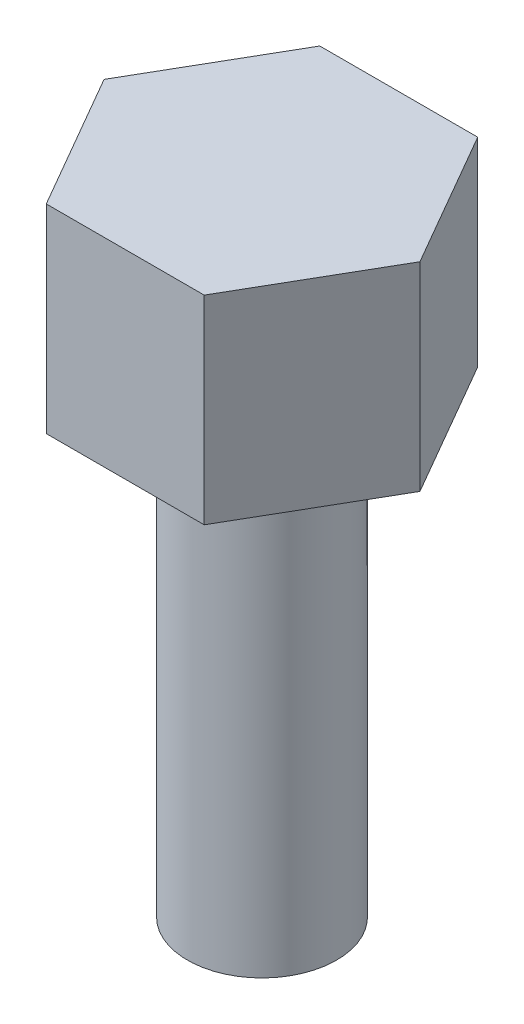
ISO-10303-21;
HEADER;
FILE_DESCRIPTION(('STEP AP214'),'2;1');
FILE_NAME('part.step','',(''),(''),'','','');
FILE_SCHEMA(('AUTOMOTIVE_DESIGN { 1 0 10303 214 1 1 1 1 }'));
ENDSEC;
DATA;
#1=APPLICATION_CONTEXT('core data for automotive mechanical design processes');
#2=APPLICATION_PROTOCOL_DEFINITION('international standard','automotive_design',2000,#1);
#3=PRODUCT_CONTEXT('',#1,'mechanical');
#4=PRODUCT('Part','Part','',(#3));
#5=PRODUCT_RELATED_PRODUCT_CATEGORY('part','',(#4));
#6=PRODUCT_DEFINITION_FORMATION('','',#4);
#7=PRODUCT_DEFINITION_CONTEXT('part definition',#1,'design');
#8=PRODUCT_DEFINITION('design','',#6,#7);
#9=PRODUCT_DEFINITION_SHAPE('','',#8);
#10=(LENGTH_UNIT() NAMED_UNIT(*) SI_UNIT(.MILLI.,.METRE.));
#11=(NAMED_UNIT(*) PLANE_ANGLE_UNIT() SI_UNIT($,.RADIAN.));
#12=(NAMED_UNIT(*) SI_UNIT($,.STERADIAN.) SOLID_ANGLE_UNIT());
#13=UNCERTAINTY_MEASURE_WITH_UNIT(LENGTH_MEASURE(1.E-05),#10,'distance_accuracy_value','');
#14=(GEOMETRIC_REPRESENTATION_CONTEXT(3) GLOBAL_UNCERTAINTY_ASSIGNED_CONTEXT((#13)) GLOBAL_UNIT_ASSIGNED_CONTEXT((#10,
#11,#12)) REPRESENTATION_CONTEXT('',''));
#15=CARTESIAN_POINT('',(0.,0.,0.));
#16=DIRECTION('',(0.,0.,1.));
#17=DIRECTION('',(1.,0.,0.));
#18=AXIS2_PLACEMENT_3D('',#15,#16,#17);
#19=CARTESIAN_POINT('',(1.58771324027147,4.,-2.75));
#20=DIRECTION('',(0.,0.,1.));
#21=DIRECTION('',(1.,0.,0.));
#22=AXIS2_PLACEMENT_3D('',#19,#20,#21);
#23=PLANE('',#22);
#24=DIRECTION('',(-1.,0.,0.));
#25=VECTOR('',#24,1.);
#26=CARTESIAN_POINT('',(1.58771324027147,0.,-2.75));
#27=LINE('',#26,#25);
#28=CARTESIAN_POINT('',(1.58771324027147,0.,-2.75));
#29=VERTEX_POINT('',#28);
#30=CARTESIAN_POINT('',(-1.58771324027147,0.,-2.75));
#31=VERTEX_POINT('',#30);
#32=EDGE_CURVE('E120',#29,#31,#27,.T.);
#33=ORIENTED_EDGE('',*,*,#32,.T.);
#34=DIRECTION('',(0.,-1.,0.));
#35=VECTOR('',#34,1.);
#36=CARTESIAN_POINT('',(-1.58771324027147,4.,-2.75));
#37=LINE('',#36,#35);
#38=CARTESIAN_POINT('',(-1.58771324027147,4.,-2.75));
#39=VERTEX_POINT('',#38);
#40=EDGE_CURVE('E37',#39,#31,#37,.T.);
#41=ORIENTED_EDGE('',*,*,#40,.F.);
#42=DIRECTION('',(-1.,0.,0.));
#43=VECTOR('',#42,1.);
#44=CARTESIAN_POINT('',(1.58771324027147,4.,-2.75));
#45=LINE('',#44,#43);
#46=CARTESIAN_POINT('',(1.58771324027147,4.,-2.75));
#47=VERTEX_POINT('',#46);
#48=EDGE_CURVE('E131',#47,#39,#45,.T.);
#49=ORIENTED_EDGE('',*,*,#48,.F.);
#50=DIRECTION('',(0.,-1.,0.));
#51=VECTOR('',#50,1.);
#52=CARTESIAN_POINT('',(1.58771324027147,4.,-2.75));
#53=LINE('',#52,#51);
#54=EDGE_CURVE('E116',#47,#29,#53,.T.);
#55=ORIENTED_EDGE('',*,*,#54,.T.);
#56=EDGE_LOOP('',(#33,#41,#49,#55));
#57=FACE_BOUND('',#56,.T.);
#58=ADVANCED_FACE('F34',(#57),#23,.F.);
#59=CARTESIAN_POINT('',(-1.58771324027147,4.,-2.75));
#60=DIRECTION('',(0.866025403784439,0.,0.5));
#61=DIRECTION('',(0.5,0.,-0.866025403784439));
#62=AXIS2_PLACEMENT_3D('',#59,#60,#61);
#63=PLANE('',#62);
#64=DIRECTION('',(-0.5,0.,0.866025403784439));
#65=VECTOR('',#64,1.);
#66=CARTESIAN_POINT('',(-1.58771324027147,0.,-2.75));
#67=LINE('',#66,#65);
#68=CARTESIAN_POINT('',(-3.17542648054294,0.,0.));
#69=VERTEX_POINT('',#68);
#70=EDGE_CURVE('E123',#31,#69,#67,.T.);
#71=ORIENTED_EDGE('',*,*,#70,.T.);
#72=DIRECTION('',(0.,-1.,0.));
#73=VECTOR('',#72,1.);
#74=CARTESIAN_POINT('',(-3.17542648054294,4.,0.));
#75=LINE('',#74,#73);
#76=CARTESIAN_POINT('',(-3.17542648054294,4.,0.));
#77=VERTEX_POINT('',#76);
#78=EDGE_CURVE('E134',#77,#69,#75,.T.);
#79=ORIENTED_EDGE('',*,*,#78,.F.);
#80=DIRECTION('',(-0.5,0.,0.866025403784439));
#81=VECTOR('',#80,1.);
#82=CARTESIAN_POINT('',(-1.58771324027147,4.,-2.75));
#83=LINE('',#82,#81);
#84=EDGE_CURVE('E89',#39,#77,#83,.T.);
#85=ORIENTED_EDGE('',*,*,#84,.F.);
#86=ORIENTED_EDGE('',*,*,#40,.T.);
#87=EDGE_LOOP('',(#71,#79,#85,#86));
#88=FACE_BOUND('',#87,.T.);
#89=ADVANCED_FACE('F139',(#88),#63,.F.);
#90=CARTESIAN_POINT('',(-3.17542648054294,4.,0.));
#91=DIRECTION('',(0.866025403784439,0.,-0.5));
#92=DIRECTION('',(-0.5,0.,-0.866025403784438));
#93=AXIS2_PLACEMENT_3D('',#90,#91,#92);
#94=PLANE('',#93);
#95=DIRECTION('',(0.5,0.,0.866025403784438));
#96=VECTOR('',#95,1.);
#97=CARTESIAN_POINT('',(-3.17542648054294,0.,0.));
#98=LINE('',#97,#96);
#99=CARTESIAN_POINT('',(-1.58771324027147,0.,2.75));
#100=VERTEX_POINT('',#99);
#101=EDGE_CURVE('E126',#69,#100,#98,.T.);
#102=ORIENTED_EDGE('',*,*,#101,.T.);
#103=DIRECTION('',(0.,-1.,0.));
#104=VECTOR('',#103,1.);
#105=CARTESIAN_POINT('',(-1.58771324027147,4.,2.75));
#106=LINE('',#105,#104);
#107=CARTESIAN_POINT('',(-1.58771324027147,4.,2.75));
#108=VERTEX_POINT('',#107);
#109=EDGE_CURVE('E111',#108,#100,#106,.T.);
#110=ORIENTED_EDGE('',*,*,#109,.F.);
#111=DIRECTION('',(0.5,0.,0.866025403784438));
#112=VECTOR('',#111,1.);
#113=CARTESIAN_POINT('',(-3.17542648054294,4.,0.));
#114=LINE('',#113,#112);
#115=EDGE_CURVE('E102',#77,#108,#114,.T.);
#116=ORIENTED_EDGE('',*,*,#115,.F.);
#117=ORIENTED_EDGE('',*,*,#78,.T.);
#118=EDGE_LOOP('',(#102,#110,#116,#117));
#119=FACE_BOUND('',#118,.T.);
#120=ADVANCED_FACE('F145',(#119),#94,.F.);
#121=CARTESIAN_POINT('',(-1.58771324027147,4.,2.75));
#122=DIRECTION('',(0.,0.,-1.));
#123=DIRECTION('',(-1.,0.,0.));
#124=AXIS2_PLACEMENT_3D('',#121,#122,#123);
#125=PLANE('',#124);
#126=DIRECTION('',(1.,0.,0.));
#127=VECTOR('',#126,1.);
#128=CARTESIAN_POINT('',(-1.58771324027147,0.,2.75));
#129=LINE('',#128,#127);
#130=CARTESIAN_POINT('',(1.58771324027147,0.,2.75));
#131=VERTEX_POINT('',#130);
#132=EDGE_CURVE('E110',#100,#131,#129,.T.);
#133=ORIENTED_EDGE('',*,*,#132,.T.);
#134=DIRECTION('',(0.,-1.,0.));
#135=VECTOR('',#134,1.);
#136=CARTESIAN_POINT('',(1.58771324027147,4.,2.75));
#137=LINE('',#136,#135);
#138=CARTESIAN_POINT('',(1.58771324027147,4.,2.75));
#139=VERTEX_POINT('',#138);
#140=EDGE_CURVE('E107',#139,#131,#137,.T.);
#141=ORIENTED_EDGE('',*,*,#140,.F.);
#142=DIRECTION('',(1.,0.,0.));
#143=VECTOR('',#142,1.);
#144=CARTESIAN_POINT('',(-1.58771324027147,4.,2.75));
#145=LINE('',#144,#143);
#146=EDGE_CURVE('E96',#108,#139,#145,.T.);
#147=ORIENTED_EDGE('',*,*,#146,.F.);
#148=ORIENTED_EDGE('',*,*,#109,.T.);
#149=EDGE_LOOP('',(#133,#141,#147,#148));
#150=FACE_BOUND('',#149,.T.);
#151=ADVANCED_FACE('F108',(#150),#125,.F.);
#152=CARTESIAN_POINT('',(1.58771324027147,4.,2.75));
#153=DIRECTION('',(-0.866025403784439,0.,-0.5));
#154=DIRECTION('',(-0.5,0.,0.866025403784439));
#155=AXIS2_PLACEMENT_3D('',#152,#153,#154);
#156=PLANE('',#155);
#157=DIRECTION('',(0.5,0.,-0.866025403784439));
#158=VECTOR('',#157,1.);
#159=CARTESIAN_POINT('',(1.58771324027147,0.,2.75));
#160=LINE('',#159,#158);
#161=CARTESIAN_POINT('',(3.17542648054294,0.,0.));
#162=VERTEX_POINT('',#161);
#163=EDGE_CURVE('E74',#131,#162,#160,.T.);
#164=ORIENTED_EDGE('',*,*,#163,.T.);
#165=DIRECTION('',(0.,-1.,0.));
#166=VECTOR('',#165,1.);
#167=CARTESIAN_POINT('',(3.17542648054294,4.,0.));
#168=LINE('',#167,#166);
#169=CARTESIAN_POINT('',(3.17542648054294,4.,0.));
#170=VERTEX_POINT('',#169);
#171=EDGE_CURVE('E112',#170,#162,#168,.T.);
#172=ORIENTED_EDGE('',*,*,#171,.F.);
#173=DIRECTION('',(0.5,0.,-0.866025403784439));
#174=VECTOR('',#173,1.);
#175=CARTESIAN_POINT('',(1.58771324027147,4.,2.75));
#176=LINE('',#175,#174);
#177=EDGE_CURVE('E100',#139,#170,#176,.T.);
#178=ORIENTED_EDGE('',*,*,#177,.F.);
#179=ORIENTED_EDGE('',*,*,#140,.T.);
#180=EDGE_LOOP('',(#164,#172,#178,#179));
#181=FACE_BOUND('',#180,.T.);
#182=ADVANCED_FACE('F114',(#181),#156,.F.);
#183=CARTESIAN_POINT('',(3.17542648054294,4.,0.));
#184=DIRECTION('',(-0.866025403784439,0.,0.5));
#185=DIRECTION('',(0.5,0.,0.866025403784439));
#186=AXIS2_PLACEMENT_3D('',#183,#184,#185);
#187=PLANE('',#186);
#188=DIRECTION('',(-0.5,0.,-0.866025403784439));
#189=VECTOR('',#188,1.);
#190=CARTESIAN_POINT('',(3.17542648054294,0.,0.));
#191=LINE('',#190,#189);
#192=EDGE_CURVE('E80',#162,#29,#191,.T.);
#193=ORIENTED_EDGE('',*,*,#192,.T.);
#194=ORIENTED_EDGE('',*,*,#54,.F.);
#195=DIRECTION('',(-0.5,0.,-0.866025403784439));
#196=VECTOR('',#195,1.);
#197=CARTESIAN_POINT('',(3.17542648054294,4.,0.));
#198=LINE('',#197,#196);
#199=EDGE_CURVE('E51',#170,#47,#198,.T.);
#200=ORIENTED_EDGE('',*,*,#199,.F.);
#201=ORIENTED_EDGE('',*,*,#171,.T.);
#202=EDGE_LOOP('',(#193,#194,#200,#201));
#203=FACE_BOUND('',#202,.T.);
#204=ADVANCED_FACE('F165',(#203),#187,.F.);
#205=CARTESIAN_POINT('',(0.,4.,0.));
#206=DIRECTION('',(0.,1.,0.));
#207=DIRECTION('',(0.,0.,1.));
#208=AXIS2_PLACEMENT_3D('',#205,#206,#207);
#209=PLANE('',#208);
#210=ORIENTED_EDGE('',*,*,#48,.T.);
#211=ORIENTED_EDGE('',*,*,#84,.T.);
#212=ORIENTED_EDGE('',*,*,#115,.T.);
#213=ORIENTED_EDGE('',*,*,#146,.T.);
#214=ORIENTED_EDGE('',*,*,#177,.T.);
#215=ORIENTED_EDGE('',*,*,#199,.T.);
#216=EDGE_LOOP('',(#210,#211,#212,#213,#214,#215));
#217=FACE_BOUND('',#216,.T.);
#218=ADVANCED_FACE('F98',(#217),#209,.T.);
#219=CARTESIAN_POINT('',(0.,0.,0.));
#220=DIRECTION('',(0.,1.,0.));
#221=DIRECTION('',(0.,0.,1.));
#222=AXIS2_PLACEMENT_3D('',#219,#220,#221);
#223=PLANE('',#222);
#224=CARTESIAN_POINT('',(0.,0.,0.));
#225=DIRECTION('',(0.,-1.,0.));
#226=DIRECTION('',(0.,0.,-1.));
#227=AXIS2_PLACEMENT_3D('',#224,#225,#226);
#228=CIRCLE('',#227,1.5);
#229=CARTESIAN_POINT('',(0.,0.,-1.5));
#230=VERTEX_POINT('',#229);
#231=EDGE_CURVE('E11',#230,#230,#228,.T.);
#232=ORIENTED_EDGE('',*,*,#231,.F.);
#233=EDGE_LOOP('',(#232));
#234=FACE_BOUND('',#233,.T.);
#235=ORIENTED_EDGE('',*,*,#32,.F.);
#236=ORIENTED_EDGE('',*,*,#192,.F.);
#237=ORIENTED_EDGE('',*,*,#163,.F.);
#238=ORIENTED_EDGE('',*,*,#132,.F.);
#239=ORIENTED_EDGE('',*,*,#101,.F.);
#240=ORIENTED_EDGE('',*,*,#70,.F.);
#241=EDGE_LOOP('',(#235,#236,#237,#238,#239,#240));
#242=FACE_BOUND('',#241,.T.);
#243=ADVANCED_FACE('F144',(#234,#242),#223,.F.);
#244=CARTESIAN_POINT('',(0.,-9.,0.));
#245=DIRECTION('',(0.,1.,0.));
#246=DIRECTION('',(0.,0.,1.));
#247=AXIS2_PLACEMENT_3D('',#244,#245,#246);
#248=CYLINDRICAL_SURFACE('',#247,1.5);
#249=CARTESIAN_POINT('',(0.,-9.,0.));
#250=DIRECTION('',(0.,-1.,0.));
#251=DIRECTION('',(0.,0.,-1.));
#252=AXIS2_PLACEMENT_3D('',#249,#250,#251);
#253=CIRCLE('',#252,1.5);
#254=CARTESIAN_POINT('',(0.,-9.,-1.5));
#255=VERTEX_POINT('',#254);
#256=EDGE_CURVE('E124',#255,#255,#253,.T.);
#257=ORIENTED_EDGE('',*,*,#256,.F.);
#258=EDGE_LOOP('',(#257));
#259=FACE_BOUND('',#258,.T.);
#260=ORIENTED_EDGE('',*,*,#231,.T.);
#261=EDGE_LOOP('',(#260));
#262=FACE_BOUND('',#261,.T.);
#263=ADVANCED_FACE('F154',(#259,#262),#248,.T.);
#264=CARTESIAN_POINT('',(0.,-9.,0.));
#265=DIRECTION('',(0.,-1.,0.));
#266=DIRECTION('',(0.,0.,-1.));
#267=AXIS2_PLACEMENT_3D('',#264,#265,#266);
#268=PLANE('',#267);
#269=ORIENTED_EDGE('',*,*,#256,.T.);
#270=EDGE_LOOP('',(#269));
#271=FACE_BOUND('',#270,.T.);
#272=ADVANCED_FACE('F152',(#271),#268,.T.);
#273=CLOSED_SHELL('',(#58,#89,#120,#151,#182,#204,#218,#243,#263,#272));
#274=MANIFOLD_SOLID_BREP('B2',#273);
#275=ADVANCED_BREP_SHAPE_REPRESENTATION('',(#18,#274),#14);
#276=SHAPE_DEFINITION_REPRESENTATION(#9,#275);
ENDSEC;
END-ISO-10303-21;
